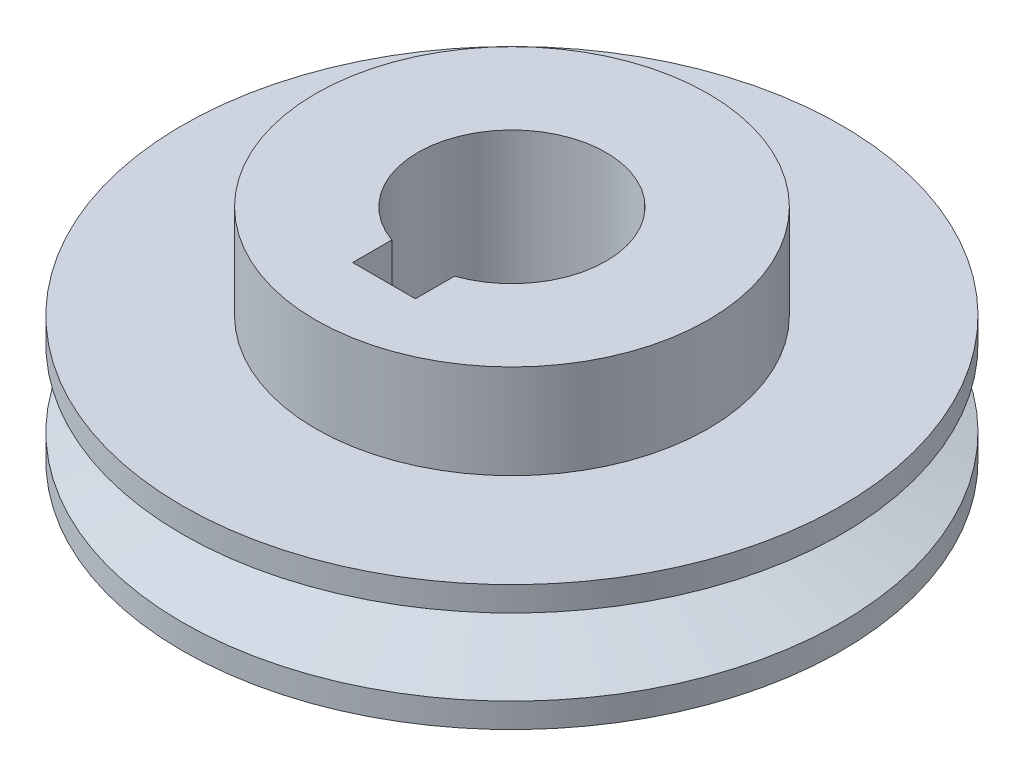
ISO-10303-21;
HEADER;
FILE_DESCRIPTION(('STEP AP214'),'2;1');
FILE_NAME('part.step','',(''),(''),'','','');
FILE_SCHEMA(('AUTOMOTIVE_DESIGN { 1 0 10303 214 1 1 1 1 }'));
ENDSEC;
DATA;
#1=APPLICATION_CONTEXT('core data for automotive mechanical design processes');
#2=APPLICATION_PROTOCOL_DEFINITION('international standard','automotive_design',2000,#1);
#3=PRODUCT_CONTEXT('',#1,'mechanical');
#4=PRODUCT('Part','Part','',(#3));
#5=PRODUCT_RELATED_PRODUCT_CATEGORY('part','',(#4));
#6=PRODUCT_DEFINITION_FORMATION('','',#4);
#7=PRODUCT_DEFINITION_CONTEXT('part definition',#1,'design');
#8=PRODUCT_DEFINITION('design','',#6,#7);
#9=PRODUCT_DEFINITION_SHAPE('','',#8);
#10=(LENGTH_UNIT() NAMED_UNIT(*) SI_UNIT(.MILLI.,.METRE.));
#11=(NAMED_UNIT(*) PLANE_ANGLE_UNIT() SI_UNIT($,.RADIAN.));
#12=(NAMED_UNIT(*) SI_UNIT($,.STERADIAN.) SOLID_ANGLE_UNIT());
#13=UNCERTAINTY_MEASURE_WITH_UNIT(LENGTH_MEASURE(1.E-05),#10,'distance_accuracy_value','');
#14=(GEOMETRIC_REPRESENTATION_CONTEXT(3) GLOBAL_UNCERTAINTY_ASSIGNED_CONTEXT((#13)) GLOBAL_UNIT_ASSIGNED_CONTEXT((#10,
#11,#12)) REPRESENTATION_CONTEXT('',''));
#15=CARTESIAN_POINT('',(0.,0.,0.));
#16=DIRECTION('',(0.,0.,1.));
#17=DIRECTION('',(1.,0.,0.));
#18=AXIS2_PLACEMENT_3D('',#15,#16,#17);
#19=CARTESIAN_POINT('',(-25.,28.,0.));
#20=DIRECTION('',(0.,-1.,0.));
#21=DIRECTION('',(0.,0.,-1.));
#22=AXIS2_PLACEMENT_3D('',#19,#20,#21);
#23=PLANE('',#22);
#24=DIRECTION('',(1.,0.,0.));
#25=VECTOR('',#24,1.);
#26=CARTESIAN_POINT('',(-4.,28.,16.3));
#27=LINE('',#26,#25);
#28=CARTESIAN_POINT('',(-4.,28.,16.3));
#29=VERTEX_POINT('',#28);
#30=CARTESIAN_POINT('',(4.,28.,16.3));
#31=VERTEX_POINT('',#30);
#32=EDGE_CURVE('E74',#29,#31,#27,.T.);
#33=ORIENTED_EDGE('',*,*,#32,.F.);
#34=DIRECTION('',(0.,0.,-1.));
#35=VECTOR('',#34,1.);
#36=CARTESIAN_POINT('',(-4.,28.,16.3));
#37=LINE('',#36,#35);
#38=CARTESIAN_POINT('',(-4.,28.,11.3137084989848));
#39=VERTEX_POINT('',#38);
#40=EDGE_CURVE('E84',#29,#39,#37,.T.);
#41=ORIENTED_EDGE('',*,*,#40,.T.);
#42=CARTESIAN_POINT('',(0.,28.,0.));
#43=DIRECTION('',(0.,1.,0.));
#44=DIRECTION('',(0.,0.,1.));
#45=AXIS2_PLACEMENT_3D('',#42,#43,#44);
#46=CIRCLE('',#45,12.);
#47=CARTESIAN_POINT('',(4.,28.,11.3137084989848));
#48=VERTEX_POINT('',#47);
#49=EDGE_CURVE('E93',#48,#39,#46,.T.);
#50=ORIENTED_EDGE('',*,*,#49,.F.);
#51=DIRECTION('',(0.,0.,-1.));
#52=VECTOR('',#51,1.);
#53=CARTESIAN_POINT('',(4.,28.,16.3));
#54=LINE('',#53,#52);
#55=EDGE_CURVE('E85',#31,#48,#54,.T.);
#56=ORIENTED_EDGE('',*,*,#55,.F.);
#57=EDGE_LOOP('',(#33,#41,#50,#56));
#58=FACE_BOUND('',#57,.T.);
#59=CARTESIAN_POINT('',(0.,28.,0.));
#60=DIRECTION('',(0.,1.,0.));
#61=DIRECTION('',(0.,0.,1.));
#62=AXIS2_PLACEMENT_3D('',#59,#60,#61);
#63=CIRCLE('',#62,25.);
#64=CARTESIAN_POINT('',(0.,28.,25.));
#65=VERTEX_POINT('',#64);
#66=EDGE_CURVE('E101',#65,#65,#63,.T.);
#67=ORIENTED_EDGE('',*,*,#66,.T.);
#68=EDGE_LOOP('',(#67));
#69=FACE_BOUND('',#68,.T.);
#70=ADVANCED_FACE('F35',(#58,#69),#23,.F.);
#71=CARTESIAN_POINT('',(0.,48.3674692029705,0.));
#72=DIRECTION('',(0.,1.,0.));
#73=DIRECTION('',(0.,0.,1.));
#74=AXIS2_PLACEMENT_3D('',#71,#72,#73);
#75=CYLINDRICAL_SURFACE('',#74,12.);
#76=ORIENTED_EDGE('',*,*,#49,.T.);
#77=DIRECTION('',(0.,1.,0.));
#78=VECTOR('',#77,1.);
#79=CARTESIAN_POINT('',(-4.,48.3674692029705,11.3137084989848));
#80=LINE('',#79,#78);
#81=CARTESIAN_POINT('',(-4.,0.,11.3137084989848));
#82=VERTEX_POINT('',#81);
#83=EDGE_CURVE('E99',#39,#82,#80,.F.);
#84=ORIENTED_EDGE('',*,*,#83,.T.);
#85=CARTESIAN_POINT('',(0.,0.,0.));
#86=DIRECTION('',(0.,1.,0.));
#87=DIRECTION('',(0.,0.,1.));
#88=AXIS2_PLACEMENT_3D('',#85,#86,#87);
#89=CIRCLE('',#88,12.);
#90=CARTESIAN_POINT('',(4.,0.,11.3137084989848));
#91=VERTEX_POINT('',#90);
#92=EDGE_CURVE('E125',#91,#82,#89,.T.);
#93=ORIENTED_EDGE('',*,*,#92,.F.);
#94=DIRECTION('',(0.,1.,0.));
#95=VECTOR('',#94,1.);
#96=CARTESIAN_POINT('',(4.,48.3674692029705,11.3137084989848));
#97=LINE('',#96,#95);
#98=EDGE_CURVE('E49',#48,#91,#97,.F.);
#99=ORIENTED_EDGE('',*,*,#98,.F.);
#100=EDGE_LOOP('',(#76,#84,#93,#99));
#101=FACE_BOUND('',#100,.T.);
#102=ADVANCED_FACE('F134',(#101),#75,.F.);
#103=CARTESIAN_POINT('',(-12.,0.,0.));
#104=DIRECTION('',(0.,1.,0.));
#105=DIRECTION('',(0.,0.,1.));
#106=AXIS2_PLACEMENT_3D('',#103,#104,#105);
#107=PLANE('',#106);
#108=CARTESIAN_POINT('',(0.,0.,0.));
#109=DIRECTION('',(0.,1.,0.));
#110=DIRECTION('',(0.,0.,1.));
#111=AXIS2_PLACEMENT_3D('',#108,#109,#110);
#112=CIRCLE('',#111,42.);
#113=CARTESIAN_POINT('',(0.,0.,42.));
#114=VERTEX_POINT('',#113);
#115=EDGE_CURVE('E122',#114,#114,#112,.T.);
#116=ORIENTED_EDGE('',*,*,#115,.F.);
#117=EDGE_LOOP('',(#116));
#118=FACE_BOUND('',#117,.T.);
#119=ORIENTED_EDGE('',*,*,#92,.T.);
#120=DIRECTION('',(0.,0.,1.));
#121=VECTOR('',#120,1.);
#122=CARTESIAN_POINT('',(-4.,0.,0.));
#123=LINE('',#122,#121);
#124=CARTESIAN_POINT('',(-4.,0.,16.3));
#125=VERTEX_POINT('',#124);
#126=EDGE_CURVE('E11',#82,#125,#123,.T.);
#127=ORIENTED_EDGE('',*,*,#126,.T.);
#128=DIRECTION('',(-1.,0.,0.));
#129=VECTOR('',#128,1.);
#130=CARTESIAN_POINT('',(-12.,0.,16.3));
#131=LINE('',#130,#129);
#132=CARTESIAN_POINT('',(4.,0.,16.3));
#133=VERTEX_POINT('',#132);
#134=EDGE_CURVE('E42',#133,#125,#131,.T.);
#135=ORIENTED_EDGE('',*,*,#134,.F.);
#136=DIRECTION('',(0.,0.,1.));
#137=VECTOR('',#136,1.);
#138=CARTESIAN_POINT('',(4.,0.,0.));
#139=LINE('',#138,#137);
#140=EDGE_CURVE('E88',#91,#133,#139,.T.);
#141=ORIENTED_EDGE('',*,*,#140,.F.);
#142=EDGE_LOOP('',(#119,#127,#135,#141));
#143=FACE_BOUND('',#142,.T.);
#144=ADVANCED_FACE('F131',(#118,#143),#107,.F.);
#145=CARTESIAN_POINT('',(0.,48.3674692029705,0.));
#146=DIRECTION('',(0.,1.,0.));
#147=DIRECTION('',(0.,0.,1.));
#148=AXIS2_PLACEMENT_3D('',#145,#146,#147);
#149=CYLINDRICAL_SURFACE('',#148,42.);
#150=CARTESIAN_POINT('',(0.,3.13853863708268,0.));
#151=DIRECTION('',(0.,1.,0.));
#152=DIRECTION('',(0.,0.,1.));
#153=AXIS2_PLACEMENT_3D('',#150,#151,#152);
#154=CIRCLE('',#153,42.);
#155=CARTESIAN_POINT('',(0.,3.13853863708268,42.));
#156=VERTEX_POINT('',#155);
#157=EDGE_CURVE('E119',#156,#156,#154,.T.);
#158=ORIENTED_EDGE('',*,*,#157,.F.);
#159=EDGE_LOOP('',(#158));
#160=FACE_BOUND('',#159,.T.);
#161=ORIENTED_EDGE('',*,*,#115,.T.);
#162=EDGE_LOOP('',(#161));
#163=FACE_BOUND('',#162,.T.);
#164=ADVANCED_FACE('F140',(#160,#163),#149,.T.);
#165=CARTESIAN_POINT('',(0.,3.13853863708268,0.));
#166=DIRECTION('',(0.,-1.,0.));
#167=DIRECTION('',(0.,0.,-1.));
#168=AXIS2_PLACEMENT_3D('',#165,#166,#167);
#169=CONICAL_SURFACE('',#168,42.,1.27409035395586);
#170=CARTESIAN_POINT('',(0.,6.50157613312792,0.));
#171=DIRECTION('',(0.,1.,0.));
#172=DIRECTION('',(0.,0.,1.));
#173=AXIS2_PLACEMENT_3D('',#170,#171,#172);
#174=CIRCLE('',#173,31.);
#175=CARTESIAN_POINT('',(0.,6.50157613312792,31.));
#176=VERTEX_POINT('',#175);
#177=EDGE_CURVE('E116',#176,#176,#174,.T.);
#178=ORIENTED_EDGE('',*,*,#177,.F.);
#179=EDGE_LOOP('',(#178));
#180=FACE_BOUND('',#179,.T.);
#181=ORIENTED_EDGE('',*,*,#157,.T.);
#182=EDGE_LOOP('',(#181));
#183=FACE_BOUND('',#182,.T.);
#184=ADVANCED_FACE('F146',(#180,#183),#169,.T.);
#185=CARTESIAN_POINT('',(0.,48.3674692029705,0.));
#186=DIRECTION('',(0.,1.,0.));
#187=DIRECTION('',(0.,0.,1.));
#188=AXIS2_PLACEMENT_3D('',#185,#186,#187);
#189=CYLINDRICAL_SURFACE('',#188,31.);
#190=CARTESIAN_POINT('',(0.,9.49842386687208,0.));
#191=DIRECTION('',(0.,1.,0.));
#192=DIRECTION('',(0.,0.,1.));
#193=AXIS2_PLACEMENT_3D('',#190,#191,#192);
#194=CIRCLE('',#193,31.);
#195=CARTESIAN_POINT('',(0.,9.49842386687208,31.));
#196=VERTEX_POINT('',#195);
#197=EDGE_CURVE('E113',#196,#196,#194,.T.);
#198=ORIENTED_EDGE('',*,*,#197,.F.);
#199=EDGE_LOOP('',(#198));
#200=FACE_BOUND('',#199,.T.);
#201=ORIENTED_EDGE('',*,*,#177,.T.);
#202=EDGE_LOOP('',(#201));
#203=FACE_BOUND('',#202,.T.);
#204=ADVANCED_FACE('F150',(#200,#203),#189,.T.);
#205=CARTESIAN_POINT('',(0.,9.49842386687208,0.));
#206=DIRECTION('',(0.,1.,0.));
#207=DIRECTION('',(0.,0.,1.));
#208=AXIS2_PLACEMENT_3D('',#205,#206,#207);
#209=CONICAL_SURFACE('',#208,31.,1.27409035395586);
#210=CARTESIAN_POINT('',(0.,12.8614613629173,0.));
#211=DIRECTION('',(0.,1.,0.));
#212=DIRECTION('',(0.,0.,1.));
#213=AXIS2_PLACEMENT_3D('',#210,#211,#212);
#214=CIRCLE('',#213,42.);
#215=CARTESIAN_POINT('',(0.,12.8614613629173,42.));
#216=VERTEX_POINT('',#215);
#217=EDGE_CURVE('E110',#216,#216,#214,.T.);
#218=ORIENTED_EDGE('',*,*,#217,.F.);
#219=EDGE_LOOP('',(#218));
#220=FACE_BOUND('',#219,.T.);
#221=ORIENTED_EDGE('',*,*,#197,.T.);
#222=EDGE_LOOP('',(#221));
#223=FACE_BOUND('',#222,.T.);
#224=ADVANCED_FACE('F154',(#220,#223),#209,.T.);
#225=CARTESIAN_POINT('',(0.,48.3674692029705,0.));
#226=DIRECTION('',(0.,1.,0.));
#227=DIRECTION('',(0.,0.,1.));
#228=AXIS2_PLACEMENT_3D('',#225,#226,#227);
#229=CYLINDRICAL_SURFACE('',#228,42.);
#230=CARTESIAN_POINT('',(0.,16.,0.));
#231=DIRECTION('',(0.,1.,0.));
#232=DIRECTION('',(0.,0.,1.));
#233=AXIS2_PLACEMENT_3D('',#230,#231,#232);
#234=CIRCLE('',#233,42.);
#235=CARTESIAN_POINT('',(0.,16.,42.));
#236=VERTEX_POINT('',#235);
#237=EDGE_CURVE('E107',#236,#236,#234,.T.);
#238=ORIENTED_EDGE('',*,*,#237,.F.);
#239=EDGE_LOOP('',(#238));
#240=FACE_BOUND('',#239,.T.);
#241=ORIENTED_EDGE('',*,*,#217,.T.);
#242=EDGE_LOOP('',(#241));
#243=FACE_BOUND('',#242,.T.);
#244=ADVANCED_FACE('F158',(#240,#243),#229,.T.);
#245=CARTESIAN_POINT('',(-42.,16.,0.));
#246=DIRECTION('',(0.,-1.,0.));
#247=DIRECTION('',(0.,0.,-1.));
#248=AXIS2_PLACEMENT_3D('',#245,#246,#247);
#249=PLANE('',#248);
#250=CARTESIAN_POINT('',(0.,16.,0.));
#251=DIRECTION('',(0.,1.,0.));
#252=DIRECTION('',(0.,0.,1.));
#253=AXIS2_PLACEMENT_3D('',#250,#251,#252);
#254=CIRCLE('',#253,25.);
#255=CARTESIAN_POINT('',(0.,16.,25.));
#256=VERTEX_POINT('',#255);
#257=EDGE_CURVE('E104',#256,#256,#254,.T.);
#258=ORIENTED_EDGE('',*,*,#257,.F.);
#259=EDGE_LOOP('',(#258));
#260=FACE_BOUND('',#259,.T.);
#261=ORIENTED_EDGE('',*,*,#237,.T.);
#262=EDGE_LOOP('',(#261));
#263=FACE_BOUND('',#262,.T.);
#264=ADVANCED_FACE('F162',(#260,#263),#249,.F.);
#265=CARTESIAN_POINT('',(0.,48.3674692029705,0.));
#266=DIRECTION('',(0.,1.,0.));
#267=DIRECTION('',(0.,0.,1.));
#268=AXIS2_PLACEMENT_3D('',#265,#266,#267);
#269=CYLINDRICAL_SURFACE('',#268,25.);
#270=ORIENTED_EDGE('',*,*,#66,.F.);
#271=EDGE_LOOP('',(#270));
#272=FACE_BOUND('',#271,.T.);
#273=ORIENTED_EDGE('',*,*,#257,.T.);
#274=EDGE_LOOP('',(#273));
#275=FACE_BOUND('',#274,.T.);
#276=ADVANCED_FACE('F166',(#272,#275),#269,.T.);
#277=CARTESIAN_POINT('',(-4.,28.,16.3));
#278=DIRECTION('',(-1.,0.,0.));
#279=DIRECTION('',(0.,0.,1.));
#280=AXIS2_PLACEMENT_3D('',#277,#278,#279);
#281=PLANE('',#280);
#282=ORIENTED_EDGE('',*,*,#40,.F.);
#283=DIRECTION('',(0.,-1.,0.));
#284=VECTOR('',#283,1.);
#285=CARTESIAN_POINT('',(-4.,28.,16.3));
#286=LINE('',#285,#284);
#287=EDGE_CURVE('E79',#29,#125,#286,.T.);
#288=ORIENTED_EDGE('',*,*,#287,.T.);
#289=ORIENTED_EDGE('',*,*,#126,.F.);
#290=ORIENTED_EDGE('',*,*,#83,.F.);
#291=EDGE_LOOP('',(#282,#288,#289,#290));
#292=FACE_BOUND('',#291,.T.);
#293=ADVANCED_FACE('F130',(#292),#281,.F.);
#294=CARTESIAN_POINT('',(-4.,28.,16.3));
#295=DIRECTION('',(0.,0.,-1.));
#296=DIRECTION('',(-1.,0.,0.));
#297=AXIS2_PLACEMENT_3D('',#294,#295,#296);
#298=PLANE('',#297);
#299=ORIENTED_EDGE('',*,*,#134,.T.);
#300=ORIENTED_EDGE('',*,*,#287,.F.);
#301=ORIENTED_EDGE('',*,*,#32,.T.);
#302=DIRECTION('',(0.,-1.,0.));
#303=VECTOR('',#302,1.);
#304=CARTESIAN_POINT('',(4.,28.,16.3));
#305=LINE('',#304,#303);
#306=EDGE_CURVE('E77',#31,#133,#305,.T.);
#307=ORIENTED_EDGE('',*,*,#306,.T.);
#308=EDGE_LOOP('',(#299,#300,#301,#307));
#309=FACE_BOUND('',#308,.T.);
#310=ADVANCED_FACE('F76',(#309),#298,.T.);
#311=CARTESIAN_POINT('',(4.,28.,16.3));
#312=DIRECTION('',(-1.,0.,0.));
#313=DIRECTION('',(0.,0.,1.));
#314=AXIS2_PLACEMENT_3D('',#311,#312,#313);
#315=PLANE('',#314);
#316=ORIENTED_EDGE('',*,*,#98,.T.);
#317=ORIENTED_EDGE('',*,*,#140,.T.);
#318=ORIENTED_EDGE('',*,*,#306,.F.);
#319=ORIENTED_EDGE('',*,*,#55,.T.);
#320=EDGE_LOOP('',(#316,#317,#318,#319));
#321=FACE_BOUND('',#320,.T.);
#322=ADVANCED_FACE('F87',(#321),#315,.T.);
#323=CLOSED_SHELL('',(#70,#102,#144,#164,#184,#204,#224,#244,#264,#276,#293,#310,#322));
#324=MANIFOLD_SOLID_BREP('B2',#323);
#325=ADVANCED_BREP_SHAPE_REPRESENTATION('',(#18,#324),#14);
#326=SHAPE_DEFINITION_REPRESENTATION(#9,#325);
ENDSEC;
END-ISO-10303-21;
